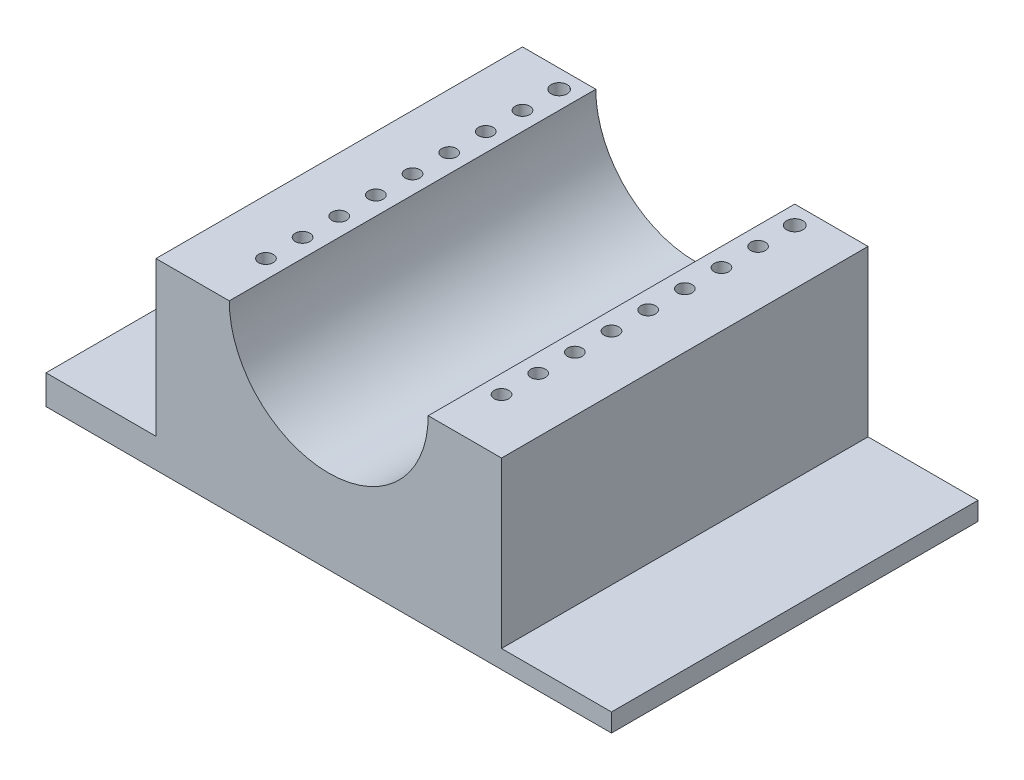
ISO-10303-21;
HEADER;
FILE_DESCRIPTION(('STEP AP214'),'2;1');
FILE_NAME('part.step','',(''),(''),'','','');
FILE_SCHEMA(('AUTOMOTIVE_DESIGN { 1 0 10303 214 1 1 1 1 }'));
ENDSEC;
DATA;
#1=APPLICATION_CONTEXT('core data for automotive mechanical design processes');
#2=APPLICATION_PROTOCOL_DEFINITION('international standard','automotive_design',2000,#1);
#3=PRODUCT_CONTEXT('',#1,'mechanical');
#4=PRODUCT('Part','Part','',(#3));
#5=PRODUCT_RELATED_PRODUCT_CATEGORY('part','',(#4));
#6=PRODUCT_DEFINITION_FORMATION('','',#4);
#7=PRODUCT_DEFINITION_CONTEXT('part definition',#1,'design');
#8=PRODUCT_DEFINITION('design','',#6,#7);
#9=PRODUCT_DEFINITION_SHAPE('','',#8);
#10=(LENGTH_UNIT() NAMED_UNIT(*) SI_UNIT(.MILLI.,.METRE.));
#11=(NAMED_UNIT(*) PLANE_ANGLE_UNIT() SI_UNIT($,.RADIAN.));
#12=(NAMED_UNIT(*) SI_UNIT($,.STERADIAN.) SOLID_ANGLE_UNIT());
#13=UNCERTAINTY_MEASURE_WITH_UNIT(LENGTH_MEASURE(1.E-05),#10,'distance_accuracy_value','');
#14=(GEOMETRIC_REPRESENTATION_CONTEXT(3) GLOBAL_UNCERTAINTY_ASSIGNED_CONTEXT((#13)) GLOBAL_UNIT_ASSIGNED_CONTEXT((#10,
#11,#12)) REPRESENTATION_CONTEXT('',''));
#15=CARTESIAN_POINT('',(0.,0.,0.));
#16=DIRECTION('',(0.,0.,1.));
#17=DIRECTION('',(1.,0.,0.));
#18=AXIS2_PLACEMENT_3D('',#15,#16,#17);
#19=CARTESIAN_POINT('',(37.1126210062295,-17.1951284898889,100.));
#20=DIRECTION('',(-1.,0.,0.));
#21=DIRECTION('',(0.,0.,1.));
#22=AXIS2_PLACEMENT_3D('',#19,#20,#21);
#23=PLANE('',#22);
#24=DIRECTION('',(0.,0.,1.));
#25=VECTOR('',#24,1.);
#26=CARTESIAN_POINT('',(37.1126210062295,-12.1951284898889,100.));
#27=LINE('',#26,#25);
#28=CARTESIAN_POINT('',(37.1126210062295,-12.1951284898889,0.));
#29=VERTEX_POINT('',#28);
#30=CARTESIAN_POINT('',(37.1126210062295,-12.1951284898889,100.));
#31=VERTEX_POINT('',#30);
#32=EDGE_CURVE('E46',#29,#31,#27,.T.);
#33=ORIENTED_EDGE('',*,*,#32,.F.);
#34=DIRECTION('',(0.,1.,0.));
#35=VECTOR('',#34,1.);
#36=CARTESIAN_POINT('',(37.1126210062295,-17.1951284898889,0.));
#37=LINE('',#36,#35);
#38=CARTESIAN_POINT('',(37.1126210062295,32.8048715101111,0.));
#39=VERTEX_POINT('',#38);
#40=EDGE_CURVE('E266',#29,#39,#37,.T.);
#41=ORIENTED_EDGE('',*,*,#40,.T.);
#42=DIRECTION('',(0.,0.,-1.));
#43=VECTOR('',#42,1.);
#44=CARTESIAN_POINT('',(37.1126210062295,32.8048715101111,100.));
#45=LINE('',#44,#43);
#46=CARTESIAN_POINT('',(37.1126210062295,32.8048715101111,100.));
#47=VERTEX_POINT('',#46);
#48=EDGE_CURVE('E11',#47,#39,#45,.T.);
#49=ORIENTED_EDGE('',*,*,#48,.F.);
#50=DIRECTION('',(0.,1.,0.));
#51=VECTOR('',#50,1.);
#52=CARTESIAN_POINT('',(37.1126210062295,-17.1951284898889,100.));
#53=LINE('',#52,#51);
#54=EDGE_CURVE('E269',#31,#47,#53,.T.);
#55=ORIENTED_EDGE('',*,*,#54,.F.);
#56=EDGE_LOOP('',(#33,#41,#49,#55));
#57=FACE_BOUND('',#56,.T.);
#58=ADVANCED_FACE('F32',(#57),#23,.F.);
#59=CARTESIAN_POINT('',(-57.1673789937705,32.8048715101111,100.));
#60=DIRECTION('',(1.,0.,0.));
#61=DIRECTION('',(0.,0.,-1.));
#62=AXIS2_PLACEMENT_3D('',#59,#60,#61);
#63=PLANE('',#62);
#64=DIRECTION('',(0.,0.,-1.));
#65=VECTOR('',#64,1.);
#66=CARTESIAN_POINT('',(-57.1673789937705,-9.19512848988893,0.));
#67=LINE('',#66,#65);
#68=CARTESIAN_POINT('',(-57.1673789937705,-9.19512848988892,100.));
#69=VERTEX_POINT('',#68);
#70=CARTESIAN_POINT('',(-57.1673789937705,-9.19512848988893,0.));
#71=VERTEX_POINT('',#70);
#72=EDGE_CURVE('E54',#69,#71,#67,.T.);
#73=ORIENTED_EDGE('',*,*,#72,.F.);
#74=DIRECTION('',(0.,-1.,0.));
#75=VECTOR('',#74,1.);
#76=CARTESIAN_POINT('',(-57.1673789937705,32.8048715101111,100.));
#77=LINE('',#76,#75);
#78=CARTESIAN_POINT('',(-57.1673789937705,32.8048715101111,100.));
#79=VERTEX_POINT('',#78);
#80=EDGE_CURVE('E121',#79,#69,#77,.T.);
#81=ORIENTED_EDGE('',*,*,#80,.F.);
#82=DIRECTION('',(0.,0.,-1.));
#83=VECTOR('',#82,1.);
#84=CARTESIAN_POINT('',(-57.1673789937705,32.8048715101111,100.));
#85=LINE('',#84,#83);
#86=CARTESIAN_POINT('',(-57.1673789937705,32.8048715101111,0.));
#87=VERTEX_POINT('',#86);
#88=EDGE_CURVE('E120',#79,#87,#85,.T.);
#89=ORIENTED_EDGE('',*,*,#88,.T.);
#90=DIRECTION('',(0.,-1.,0.));
#91=VECTOR('',#90,1.);
#92=CARTESIAN_POINT('',(-57.1673789937705,32.8048715101111,0.));
#93=LINE('',#92,#91);
#94=EDGE_CURVE('E285',#87,#71,#93,.T.);
#95=ORIENTED_EDGE('',*,*,#94,.T.);
#96=EDGE_LOOP('',(#73,#81,#89,#95));
#97=FACE_BOUND('',#96,.T.);
#98=ADVANCED_FACE('F310',(#97),#63,.F.);
#99=CARTESIAN_POINT('',(37.1126210062295,32.8048715101111,100.));
#100=DIRECTION('',(0.,-1.,0.));
#101=DIRECTION('',(1.,0.,0.));
#102=AXIS2_PLACEMENT_3D('',#99,#100,#101);
#103=PLANE('',#102);
#104=CARTESIAN_POINT('',(22.1126210062295,32.8048715101111,4.99999999999999));
#105=DIRECTION('',(0.,-1.,0.));
#106=DIRECTION('',(0.,0.,-1.));
#107=AXIS2_PLACEMENT_3D('',#104,#105,#106);
#108=CIRCLE('',#107,2.2);
#109=CARTESIAN_POINT('',(22.1126210062295,32.8048715101111,2.79999999999999));
#110=VERTEX_POINT('',#109);
#111=EDGE_CURVE('E198',#110,#110,#108,.T.);
#112=ORIENTED_EDGE('',*,*,#111,.T.);
#113=EDGE_LOOP('',(#112));
#114=FACE_BOUND('',#113,.T.);
#115=CARTESIAN_POINT('',(22.1126210062293,32.8048715101111,15.));
#116=DIRECTION('',(0.,-1.,0.));
#117=DIRECTION('',(0.,0.,-1.));
#118=AXIS2_PLACEMENT_3D('',#115,#116,#117);
#119=CIRCLE('',#118,2.00000000000001);
#120=CARTESIAN_POINT('',(22.1126210062293,32.8048715101111,13.));
#121=VERTEX_POINT('',#120);
#122=EDGE_CURVE('E204',#121,#121,#119,.T.);
#123=ORIENTED_EDGE('',*,*,#122,.T.);
#124=EDGE_LOOP('',(#123));
#125=FACE_BOUND('',#124,.T.);
#126=CARTESIAN_POINT('',(22.1126210062292,32.8048715101111,25.));
#127=DIRECTION('',(0.,-1.,0.));
#128=DIRECTION('',(0.,0.,-1.));
#129=AXIS2_PLACEMENT_3D('',#126,#127,#128);
#130=CIRCLE('',#129,2.);
#131=CARTESIAN_POINT('',(22.1126210062292,32.8048715101111,23.));
#132=VERTEX_POINT('',#131);
#133=EDGE_CURVE('E210',#132,#132,#130,.T.);
#134=ORIENTED_EDGE('',*,*,#133,.T.);
#135=EDGE_LOOP('',(#134));
#136=FACE_BOUND('',#135,.T.);
#137=CARTESIAN_POINT('',(22.1126210062287,32.8048715101111,75.));
#138=DIRECTION('',(0.,-1.,0.));
#139=DIRECTION('',(0.,0.,-1.));
#140=AXIS2_PLACEMENT_3D('',#137,#138,#139);
#141=CIRCLE('',#140,2.);
#142=CARTESIAN_POINT('',(22.1126210062287,32.8048715101111,73.));
#143=VERTEX_POINT('',#142);
#144=EDGE_CURVE('E167',#143,#143,#141,.T.);
#145=ORIENTED_EDGE('',*,*,#144,.T.);
#146=EDGE_LOOP('',(#145));
#147=FACE_BOUND('',#146,.T.);
#148=CARTESIAN_POINT('',(22.1126210062289,32.8048715101111,55.));
#149=DIRECTION('',(0.,-1.,0.));
#150=DIRECTION('',(0.,0.,-1.));
#151=AXIS2_PLACEMENT_3D('',#148,#149,#150);
#152=CIRCLE('',#151,2.);
#153=CARTESIAN_POINT('',(22.1126210062289,32.8048715101111,53.));
#154=VERTEX_POINT('',#153);
#155=EDGE_CURVE('E186',#154,#154,#152,.T.);
#156=ORIENTED_EDGE('',*,*,#155,.T.);
#157=EDGE_LOOP('',(#156));
#158=FACE_BOUND('',#157,.T.);
#159=CARTESIAN_POINT('',(22.1126210062291,32.8048715101111,45.));
#160=DIRECTION('',(0.,-1.,0.));
#161=DIRECTION('',(0.,0.,-1.));
#162=AXIS2_PLACEMENT_3D('',#159,#160,#161);
#163=CIRCLE('',#162,2.);
#164=CARTESIAN_POINT('',(22.1126210062291,32.8048715101111,43.));
#165=VERTEX_POINT('',#164);
#166=EDGE_CURVE('E179',#165,#165,#163,.T.);
#167=ORIENTED_EDGE('',*,*,#166,.T.);
#168=EDGE_LOOP('',(#167));
#169=FACE_BOUND('',#168,.T.);
#170=CARTESIAN_POINT('',(22.1126210062291,32.8048715101111,35.));
#171=DIRECTION('',(0.,1.,0.));
#172=DIRECTION('',(0.,0.,1.));
#173=AXIS2_PLACEMENT_3D('',#170,#171,#172);
#174=CIRCLE('',#173,2.00000000000001);
#175=CARTESIAN_POINT('',(22.1126210062291,32.8048715101111,37.));
#176=VERTEX_POINT('',#175);
#177=EDGE_CURVE('E258',#176,#176,#174,.F.);
#178=ORIENTED_EDGE('',*,*,#177,.T.);
#179=EDGE_LOOP('',(#178));
#180=FACE_BOUND('',#179,.T.);
#181=CARTESIAN_POINT('',(22.1126210062288,32.8048715101111,65.));
#182=DIRECTION('',(0.,1.,0.));
#183=DIRECTION('',(0.,0.,1.));
#184=AXIS2_PLACEMENT_3D('',#181,#182,#183);
#185=CIRCLE('',#184,2.);
#186=CARTESIAN_POINT('',(22.1126210062288,32.8048715101111,67.));
#187=VERTEX_POINT('',#186);
#188=EDGE_CURVE('E215',#187,#187,#185,.F.);
#189=ORIENTED_EDGE('',*,*,#188,.T.);
#190=EDGE_LOOP('',(#189));
#191=FACE_BOUND('',#190,.T.);
#192=CARTESIAN_POINT('',(22.1126210062286,32.8048715101111,85.));
#193=DIRECTION('',(0.,1.,0.));
#194=DIRECTION('',(0.,0.,1.));
#195=AXIS2_PLACEMENT_3D('',#192,#193,#194);
#196=CIRCLE('',#195,2.00000000000001);
#197=CARTESIAN_POINT('',(22.1126210062286,32.8048715101111,87.));
#198=VERTEX_POINT('',#197);
#199=EDGE_CURVE('E242',#198,#198,#196,.F.);
#200=ORIENTED_EDGE('',*,*,#199,.T.);
#201=EDGE_LOOP('',(#200));
#202=FACE_BOUND('',#201,.T.);
#203=DIRECTION('',(-1.,0.,0.));
#204=VECTOR('',#203,1.);
#205=CARTESIAN_POINT('',(37.1126210062295,32.8048715101111,0.));
#206=LINE('',#205,#204);
#207=CARTESIAN_POINT('',(17.1126210062295,32.8048715101111,0.));
#208=VERTEX_POINT('',#207);
#209=EDGE_CURVE('E279',#39,#208,#206,.T.);
#210=ORIENTED_EDGE('',*,*,#209,.T.);
#211=DIRECTION('',(0.,0.,-1.));
#212=VECTOR('',#211,1.);
#213=CARTESIAN_POINT('',(17.1126210062295,32.8048715101111,100.));
#214=LINE('',#213,#212);
#215=CARTESIAN_POINT('',(17.1126210062295,32.8048715101111,100.));
#216=VERTEX_POINT('',#215);
#217=EDGE_CURVE('E39',#216,#208,#214,.T.);
#218=ORIENTED_EDGE('',*,*,#217,.F.);
#219=DIRECTION('',(-1.,0.,0.));
#220=VECTOR('',#219,1.);
#221=CARTESIAN_POINT('',(37.1126210062295,32.8048715101111,100.));
#222=LINE('',#221,#220);
#223=EDGE_CURVE('E271',#47,#216,#222,.T.);
#224=ORIENTED_EDGE('',*,*,#223,.F.);
#225=ORIENTED_EDGE('',*,*,#48,.T.);
#226=EDGE_LOOP('',(#210,#218,#224,#225));
#227=FACE_BOUND('',#226,.T.);
#228=ADVANCED_FACE('F322',(#114,#125,#136,#147,#158,#169,#180,#191,#202,#227),#103,.F.);
#229=CARTESIAN_POINT('',(-10.0273789937705,32.8048715101111,100.));
#230=DIRECTION('',(0.,0.,-1.));
#231=DIRECTION('',(-1.,0.,0.));
#232=AXIS2_PLACEMENT_3D('',#229,#230,#231);
#233=CYLINDRICAL_SURFACE('',#232,27.14);
#234=CARTESIAN_POINT('',(-10.0273789937705,32.8048715101111,0.));
#235=DIRECTION('',(0.,0.,-1.));
#236=DIRECTION('',(-1.,0.,0.));
#237=AXIS2_PLACEMENT_3D('',#234,#235,#236);
#238=CIRCLE('',#237,27.14);
#239=CARTESIAN_POINT('',(-37.1673789937705,32.8048715101111,0.));
#240=VERTEX_POINT('',#239);
#241=EDGE_CURVE('E281',#208,#240,#238,.T.);
#242=ORIENTED_EDGE('',*,*,#241,.T.);
#243=DIRECTION('',(0.,0.,-1.));
#244=VECTOR('',#243,1.);
#245=CARTESIAN_POINT('',(-37.1673789937705,32.8048715101111,100.));
#246=LINE('',#245,#244);
#247=CARTESIAN_POINT('',(-37.1673789937705,32.8048715101111,100.));
#248=VERTEX_POINT('',#247);
#249=EDGE_CURVE('E290',#248,#240,#246,.T.);
#250=ORIENTED_EDGE('',*,*,#249,.F.);
#251=CARTESIAN_POINT('',(-10.0273789937705,32.8048715101111,100.));
#252=DIRECTION('',(0.,0.,-1.));
#253=DIRECTION('',(-1.,0.,0.));
#254=AXIS2_PLACEMENT_3D('',#251,#252,#253);
#255=CIRCLE('',#254,27.14);
#256=EDGE_CURVE('E273',#216,#248,#255,.T.);
#257=ORIENTED_EDGE('',*,*,#256,.F.);
#258=ORIENTED_EDGE('',*,*,#217,.T.);
#259=EDGE_LOOP('',(#242,#250,#257,#258));
#260=FACE_BOUND('',#259,.T.);
#261=ADVANCED_FACE('F297',(#260),#233,.F.);
#262=CARTESIAN_POINT('',(-57.1673789937705,32.8048715101111,100.));
#263=DIRECTION('',(0.,-1.,0.));
#264=DIRECTION('',(0.,0.,-1.));
#265=AXIS2_PLACEMENT_3D('',#262,#263,#264);
#266=PLANE('',#265);
#267=CARTESIAN_POINT('',(-42.1673789937705,32.8048715101111,5.00000000000005));
#268=DIRECTION('',(0.,1.,0.));
#269=DIRECTION('',(0.,0.,1.));
#270=AXIS2_PLACEMENT_3D('',#267,#268,#269);
#271=CIRCLE('',#270,2.2);
#272=CARTESIAN_POINT('',(-42.1673789937705,32.8048715101111,7.20000000000005));
#273=VERTEX_POINT('',#272);
#274=EDGE_CURVE('E191',#273,#273,#271,.T.);
#275=ORIENTED_EDGE('',*,*,#274,.F.);
#276=EDGE_LOOP('',(#275));
#277=FACE_BOUND('',#276,.T.);
#278=CARTESIAN_POINT('',(-42.1673789937704,32.8048715101111,15.));
#279=DIRECTION('',(0.,1.,0.));
#280=DIRECTION('',(0.,0.,1.));
#281=AXIS2_PLACEMENT_3D('',#278,#279,#280);
#282=CIRCLE('',#281,2.);
#283=CARTESIAN_POINT('',(-42.1673789937704,32.8048715101111,17.));
#284=VERTEX_POINT('',#283);
#285=EDGE_CURVE('E174',#284,#284,#282,.T.);
#286=ORIENTED_EDGE('',*,*,#285,.F.);
#287=EDGE_LOOP('',(#286));
#288=FACE_BOUND('',#287,.T.);
#289=CARTESIAN_POINT('',(-42.1673789937697,32.8048715101111,85.));
#290=DIRECTION('',(0.,1.,0.));
#291=DIRECTION('',(0.,0.,1.));
#292=AXIS2_PLACEMENT_3D('',#289,#290,#291);
#293=CIRCLE('',#292,2.);
#294=CARTESIAN_POINT('',(-42.1673789937697,32.8048715101111,87.));
#295=VERTEX_POINT('',#294);
#296=EDGE_CURVE('E239',#295,#295,#293,.T.);
#297=ORIENTED_EDGE('',*,*,#296,.F.);
#298=EDGE_LOOP('',(#297));
#299=FACE_BOUND('',#298,.T.);
#300=CARTESIAN_POINT('',(-42.1673789937698,32.8048715101111,75.));
#301=DIRECTION('',(0.,1.,0.));
#302=DIRECTION('',(0.,0.,1.));
#303=AXIS2_PLACEMENT_3D('',#300,#301,#302);
#304=CIRCLE('',#303,2.);
#305=CARTESIAN_POINT('',(-42.1673789937698,32.8048715101111,77.));
#306=VERTEX_POINT('',#305);
#307=EDGE_CURVE('E246',#306,#306,#304,.T.);
#308=ORIENTED_EDGE('',*,*,#307,.F.);
#309=EDGE_LOOP('',(#308));
#310=FACE_BOUND('',#309,.T.);
#311=CARTESIAN_POINT('',(-42.1673789937699,32.8048715101111,65.));
#312=DIRECTION('',(0.,1.,0.));
#313=DIRECTION('',(0.,0.,1.));
#314=AXIS2_PLACEMENT_3D('',#311,#312,#313);
#315=CIRCLE('',#314,2.);
#316=CARTESIAN_POINT('',(-42.1673789937699,32.8048715101111,67.));
#317=VERTEX_POINT('',#316);
#318=EDGE_CURVE('E252',#317,#317,#315,.T.);
#319=ORIENTED_EDGE('',*,*,#318,.F.);
#320=EDGE_LOOP('',(#319));
#321=FACE_BOUND('',#320,.T.);
#322=CARTESIAN_POINT('',(-42.16737899377,32.8048715101111,55.));
#323=DIRECTION('',(0.,1.,0.));
#324=DIRECTION('',(0.,0.,1.));
#325=AXIS2_PLACEMENT_3D('',#322,#323,#324);
#326=CIRCLE('',#325,2.);
#327=CARTESIAN_POINT('',(-42.16737899377,32.8048715101111,57.));
#328=VERTEX_POINT('',#327);
#329=EDGE_CURVE('E222',#328,#328,#326,.T.);
#330=ORIENTED_EDGE('',*,*,#329,.F.);
#331=EDGE_LOOP('',(#330));
#332=FACE_BOUND('',#331,.T.);
#333=CARTESIAN_POINT('',(-42.1673789937701,32.8048715101111,45.));
#334=DIRECTION('',(0.,1.,0.));
#335=DIRECTION('',(0.,0.,1.));
#336=AXIS2_PLACEMENT_3D('',#333,#334,#335);
#337=CIRCLE('',#336,2.);
#338=CARTESIAN_POINT('',(-42.1673789937701,32.8048715101111,47.));
#339=VERTEX_POINT('',#338);
#340=EDGE_CURVE('E228',#339,#339,#337,.T.);
#341=ORIENTED_EDGE('',*,*,#340,.F.);
#342=EDGE_LOOP('',(#341));
#343=FACE_BOUND('',#342,.T.);
#344=CARTESIAN_POINT('',(-42.1673789937702,32.8048715101111,35.));
#345=DIRECTION('',(0.,1.,0.));
#346=DIRECTION('',(0.,0.,1.));
#347=AXIS2_PLACEMENT_3D('',#344,#345,#346);
#348=CIRCLE('',#347,2.);
#349=CARTESIAN_POINT('',(-42.1673789937702,32.8048715101111,37.));
#350=VERTEX_POINT('',#349);
#351=EDGE_CURVE('E234',#350,#350,#348,.T.);
#352=ORIENTED_EDGE('',*,*,#351,.F.);
#353=EDGE_LOOP('',(#352));
#354=FACE_BOUND('',#353,.T.);
#355=CARTESIAN_POINT('',(-42.1673789937703,32.8048715101111,25.));
#356=DIRECTION('',(0.,1.,0.));
#357=DIRECTION('',(0.,0.,1.));
#358=AXIS2_PLACEMENT_3D('',#355,#356,#357);
#359=CIRCLE('',#358,2.);
#360=CARTESIAN_POINT('',(-42.1673789937703,32.8048715101111,27.));
#361=VERTEX_POINT('',#360);
#362=EDGE_CURVE('E161',#361,#361,#359,.T.);
#363=ORIENTED_EDGE('',*,*,#362,.F.);
#364=EDGE_LOOP('',(#363));
#365=FACE_BOUND('',#364,.T.);
#366=DIRECTION('',(-1.,0.,0.));
#367=VECTOR('',#366,1.);
#368=CARTESIAN_POINT('',(-57.1673789937705,32.8048715101111,0.));
#369=LINE('',#368,#367);
#370=EDGE_CURVE('E283',#240,#87,#369,.T.);
#371=ORIENTED_EDGE('',*,*,#370,.T.);
#372=ORIENTED_EDGE('',*,*,#88,.F.);
#373=DIRECTION('',(-1.,0.,0.));
#374=VECTOR('',#373,1.);
#375=CARTESIAN_POINT('',(-57.1673789937705,32.8048715101111,100.));
#376=LINE('',#375,#374);
#377=EDGE_CURVE('E275',#248,#79,#376,.T.);
#378=ORIENTED_EDGE('',*,*,#377,.F.);
#379=ORIENTED_EDGE('',*,*,#249,.T.);
#380=EDGE_LOOP('',(#371,#372,#378,#379));
#381=FACE_BOUND('',#380,.T.);
#382=ADVANCED_FACE('F308',(#277,#288,#299,#310,#321,#332,#343,#354,#365,#381),#266,.F.);
#383=CARTESIAN_POINT('',(37.1126210062295,-17.1951284898889,100.));
#384=DIRECTION('',(0.,1.,0.));
#385=DIRECTION('',(-1.,0.,0.));
#386=AXIS2_PLACEMENT_3D('',#383,#384,#385);
#387=PLANE('',#386);
#388=DIRECTION('',(1.,0.,0.));
#389=VECTOR('',#388,1.);
#390=CARTESIAN_POINT('',(37.1126210062295,-17.1951284898889,0.));
#391=LINE('',#390,#389);
#392=CARTESIAN_POINT('',(-87.1673789937705,-17.1951284898889,0.));
#393=VERTEX_POINT('',#392);
#394=CARTESIAN_POINT('',(67.1126210062295,-17.1951284898889,0.));
#395=VERTEX_POINT('',#394);
#396=EDGE_CURVE('E126',#393,#395,#391,.T.);
#397=ORIENTED_EDGE('',*,*,#396,.T.);
#398=DIRECTION('',(0.,0.,-1.));
#399=VECTOR('',#398,1.);
#400=CARTESIAN_POINT('',(67.1126210062295,-17.1951284898889,100.));
#401=LINE('',#400,#399);
#402=CARTESIAN_POINT('',(67.1126210062295,-17.1951284898889,100.));
#403=VERTEX_POINT('',#402);
#404=EDGE_CURVE('E124',#403,#395,#401,.T.);
#405=ORIENTED_EDGE('',*,*,#404,.F.);
#406=DIRECTION('',(1.,0.,0.));
#407=VECTOR('',#406,1.);
#408=CARTESIAN_POINT('',(37.1126210062295,-17.1951284898889,100.));
#409=LINE('',#408,#407);
#410=CARTESIAN_POINT('',(-87.1673789937705,-17.1951284898889,100.));
#411=VERTEX_POINT('',#410);
#412=EDGE_CURVE('E109',#411,#403,#409,.T.);
#413=ORIENTED_EDGE('',*,*,#412,.F.);
#414=DIRECTION('',(0.,0.,1.));
#415=VECTOR('',#414,1.);
#416=CARTESIAN_POINT('',(-87.1673789937705,-17.1951284898889,0.));
#417=LINE('',#416,#415);
#418=EDGE_CURVE('E148',#393,#411,#417,.T.);
#419=ORIENTED_EDGE('',*,*,#418,.F.);
#420=EDGE_LOOP('',(#397,#405,#413,#419));
#421=FACE_BOUND('',#420,.T.);
#422=ADVANCED_FACE('F125',(#421),#387,.F.);
#423=CARTESIAN_POINT('',(-10.0273789937705,32.8048715101111,100.));
#424=DIRECTION('',(0.,0.,-1.));
#425=DIRECTION('',(-1.,0.,0.));
#426=AXIS2_PLACEMENT_3D('',#423,#424,#425);
#427=PLANE('',#426);
#428=ORIENTED_EDGE('',*,*,#412,.T.);
#429=DIRECTION('',(0.,-1.,0.));
#430=VECTOR('',#429,1.);
#431=CARTESIAN_POINT('',(67.1126210062295,-17.1951284898889,100.));
#432=LINE('',#431,#430);
#433=CARTESIAN_POINT('',(67.1126210062295,-12.1951284898889,100.));
#434=VERTEX_POINT('',#433);
#435=EDGE_CURVE('E114',#434,#403,#432,.T.);
#436=ORIENTED_EDGE('',*,*,#435,.F.);
#437=DIRECTION('',(-1.,0.,0.));
#438=VECTOR('',#437,1.);
#439=CARTESIAN_POINT('',(67.1126210062295,-12.1951284898889,100.));
#440=LINE('',#439,#438);
#441=EDGE_CURVE('E139',#434,#31,#440,.T.);
#442=ORIENTED_EDGE('',*,*,#441,.T.);
#443=ORIENTED_EDGE('',*,*,#54,.T.);
#444=ORIENTED_EDGE('',*,*,#223,.T.);
#445=ORIENTED_EDGE('',*,*,#256,.T.);
#446=ORIENTED_EDGE('',*,*,#377,.T.);
#447=ORIENTED_EDGE('',*,*,#80,.T.);
#448=DIRECTION('',(1.,0.,0.));
#449=VECTOR('',#448,1.);
#450=CARTESIAN_POINT('',(-87.1673789937705,-9.19512848988893,100.));
#451=LINE('',#450,#449);
#452=CARTESIAN_POINT('',(-87.1673789937705,-9.19512848988893,100.));
#453=VERTEX_POINT('',#452);
#454=EDGE_CURVE('E157',#453,#69,#451,.T.);
#455=ORIENTED_EDGE('',*,*,#454,.F.);
#456=DIRECTION('',(0.,1.,0.));
#457=VECTOR('',#456,1.);
#458=CARTESIAN_POINT('',(-87.1673789937705,-17.1951284898889,100.));
#459=LINE('',#458,#457);
#460=EDGE_CURVE('E116',#411,#453,#459,.T.);
#461=ORIENTED_EDGE('',*,*,#460,.F.);
#462=EDGE_LOOP('',(#428,#436,#442,#443,#444,#445,#446,#447,#455,#461));
#463=FACE_BOUND('',#462,.T.);
#464=ADVANCED_FACE('F111',(#463),#427,.F.);
#465=CARTESIAN_POINT('',(-10.0273789937705,32.8048715101111,0.));
#466=DIRECTION('',(0.,0.,-1.));
#467=DIRECTION('',(-1.,0.,0.));
#468=AXIS2_PLACEMENT_3D('',#465,#466,#467);
#469=PLANE('',#468);
#470=ORIENTED_EDGE('',*,*,#40,.F.);
#471=DIRECTION('',(-1.,0.,0.));
#472=VECTOR('',#471,1.);
#473=CARTESIAN_POINT('',(67.1126210062295,-12.1951284898889,0.));
#474=LINE('',#473,#472);
#475=CARTESIAN_POINT('',(67.1126210062295,-12.1951284898889,0.));
#476=VERTEX_POINT('',#475);
#477=EDGE_CURVE('E142',#476,#29,#474,.T.);
#478=ORIENTED_EDGE('',*,*,#477,.F.);
#479=DIRECTION('',(0.,1.,0.));
#480=VECTOR('',#479,1.);
#481=CARTESIAN_POINT('',(67.1126210062295,-17.1951284898889,0.));
#482=LINE('',#481,#480);
#483=EDGE_CURVE('E129',#395,#476,#482,.T.);
#484=ORIENTED_EDGE('',*,*,#483,.F.);
#485=ORIENTED_EDGE('',*,*,#396,.F.);
#486=DIRECTION('',(0.,-1.,0.));
#487=VECTOR('',#486,1.);
#488=CARTESIAN_POINT('',(-87.1673789937705,-17.1951284898889,0.));
#489=LINE('',#488,#487);
#490=CARTESIAN_POINT('',(-87.1673789937705,-9.19512848988893,0.));
#491=VERTEX_POINT('',#490);
#492=EDGE_CURVE('E145',#491,#393,#489,.T.);
#493=ORIENTED_EDGE('',*,*,#492,.F.);
#494=DIRECTION('',(1.,0.,0.));
#495=VECTOR('',#494,1.);
#496=CARTESIAN_POINT('',(-87.1673789937705,-9.19512848988893,0.));
#497=LINE('',#496,#495);
#498=EDGE_CURVE('E153',#491,#71,#497,.T.);
#499=ORIENTED_EDGE('',*,*,#498,.T.);
#500=ORIENTED_EDGE('',*,*,#94,.F.);
#501=ORIENTED_EDGE('',*,*,#370,.F.);
#502=ORIENTED_EDGE('',*,*,#241,.F.);
#503=ORIENTED_EDGE('',*,*,#209,.F.);
#504=EDGE_LOOP('',(#470,#478,#484,#485,#493,#499,#500,#501,#502,#503));
#505=FACE_BOUND('',#504,.T.);
#506=ADVANCED_FACE('F304',(#505),#469,.T.);
#507=CARTESIAN_POINT('',(-42.1673789937703,26.8048715101111,25.));
#508=DIRECTION('',(0.,1.,0.));
#509=DIRECTION('',(0.,0.,1.));
#510=AXIS2_PLACEMENT_3D('',#507,#508,#509);
#511=CYLINDRICAL_SURFACE('',#510,2.);
#512=CARTESIAN_POINT('',(-42.1673789937703,26.8048715101111,25.));
#513=DIRECTION('',(0.,1.,0.));
#514=DIRECTION('',(0.,0.,1.));
#515=AXIS2_PLACEMENT_3D('',#512,#513,#514);
#516=CIRCLE('',#515,2.);
#517=CARTESIAN_POINT('',(-42.1673789937703,26.8048715101111,27.));
#518=VERTEX_POINT('',#517);
#519=EDGE_CURVE('E160',#518,#518,#516,.T.);
#520=ORIENTED_EDGE('',*,*,#519,.F.);
#521=EDGE_LOOP('',(#520));
#522=FACE_BOUND('',#521,.T.);
#523=ORIENTED_EDGE('',*,*,#362,.T.);
#524=EDGE_LOOP('',(#523));
#525=FACE_BOUND('',#524,.T.);
#526=ADVANCED_FACE('F365',(#522,#525),#511,.F.);
#527=CARTESIAN_POINT('',(-42.1673789937703,26.8048715101111,25.));
#528=DIRECTION('',(0.,1.,0.));
#529=DIRECTION('',(0.,0.,1.));
#530=AXIS2_PLACEMENT_3D('',#527,#528,#529);
#531=PLANE('',#530);
#532=ORIENTED_EDGE('',*,*,#519,.T.);
#533=EDGE_LOOP('',(#532));
#534=FACE_BOUND('',#533,.T.);
#535=ADVANCED_FACE('F371',(#534),#531,.T.);
#536=CARTESIAN_POINT('',(-42.1673789937702,26.8048715101111,35.));
#537=DIRECTION('',(0.,1.,0.));
#538=DIRECTION('',(0.,0.,1.));
#539=AXIS2_PLACEMENT_3D('',#536,#537,#538);
#540=CYLINDRICAL_SURFACE('',#539,2.);
#541=CARTESIAN_POINT('',(-42.1673789937702,26.8048715101111,35.));
#542=DIRECTION('',(0.,1.,0.));
#543=DIRECTION('',(0.,0.,1.));
#544=AXIS2_PLACEMENT_3D('',#541,#542,#543);
#545=CIRCLE('',#544,2.);
#546=CARTESIAN_POINT('',(-42.1673789937702,26.8048715101111,37.));
#547=VERTEX_POINT('',#546);
#548=EDGE_CURVE('E194',#547,#547,#545,.T.);
#549=ORIENTED_EDGE('',*,*,#548,.F.);
#550=EDGE_LOOP('',(#549));
#551=FACE_BOUND('',#550,.T.);
#552=ORIENTED_EDGE('',*,*,#351,.T.);
#553=EDGE_LOOP('',(#552));
#554=FACE_BOUND('',#553,.T.);
#555=ADVANCED_FACE('F379',(#551,#554),#540,.F.);
#556=CARTESIAN_POINT('',(-42.1673789937702,26.8048715101111,35.));
#557=DIRECTION('',(0.,1.,0.));
#558=DIRECTION('',(0.,0.,1.));
#559=AXIS2_PLACEMENT_3D('',#556,#557,#558);
#560=PLANE('',#559);
#561=ORIENTED_EDGE('',*,*,#548,.T.);
#562=EDGE_LOOP('',(#561));
#563=FACE_BOUND('',#562,.T.);
#564=ADVANCED_FACE('F387',(#563),#560,.T.);
#565=CARTESIAN_POINT('',(-42.1673789937701,26.8048715101111,45.));
#566=DIRECTION('',(0.,1.,0.));
#567=DIRECTION('',(0.,0.,1.));
#568=AXIS2_PLACEMENT_3D('',#565,#566,#567);
#569=CYLINDRICAL_SURFACE('',#568,2.);
#570=CARTESIAN_POINT('',(-42.1673789937701,26.8048715101111,45.));
#571=DIRECTION('',(0.,1.,0.));
#572=DIRECTION('',(0.,0.,1.));
#573=AXIS2_PLACEMENT_3D('',#570,#571,#572);
#574=CIRCLE('',#573,2.);
#575=CARTESIAN_POINT('',(-42.1673789937701,26.8048715101111,47.));
#576=VERTEX_POINT('',#575);
#577=EDGE_CURVE('E231',#576,#576,#574,.T.);
#578=ORIENTED_EDGE('',*,*,#577,.F.);
#579=EDGE_LOOP('',(#578));
#580=FACE_BOUND('',#579,.T.);
#581=ORIENTED_EDGE('',*,*,#340,.T.);
#582=EDGE_LOOP('',(#581));
#583=FACE_BOUND('',#582,.T.);
#584=ADVANCED_FACE('F395',(#580,#583),#569,.F.);
#585=CARTESIAN_POINT('',(-42.1673789937701,26.8048715101111,45.));
#586=DIRECTION('',(0.,1.,0.));
#587=DIRECTION('',(0.,0.,1.));
#588=AXIS2_PLACEMENT_3D('',#585,#586,#587);
#589=PLANE('',#588);
#590=ORIENTED_EDGE('',*,*,#577,.T.);
#591=EDGE_LOOP('',(#590));
#592=FACE_BOUND('',#591,.T.);
#593=ADVANCED_FACE('F403',(#592),#589,.T.);
#594=CARTESIAN_POINT('',(-42.16737899377,26.8048715101111,55.));
#595=DIRECTION('',(0.,1.,0.));
#596=DIRECTION('',(0.,0.,1.));
#597=AXIS2_PLACEMENT_3D('',#594,#595,#596);
#598=CYLINDRICAL_SURFACE('',#597,2.);
#599=CARTESIAN_POINT('',(-42.16737899377,26.8048715101111,55.));
#600=DIRECTION('',(0.,1.,0.));
#601=DIRECTION('',(0.,0.,1.));
#602=AXIS2_PLACEMENT_3D('',#599,#600,#601);
#603=CIRCLE('',#602,2.);
#604=CARTESIAN_POINT('',(-42.16737899377,26.8048715101111,57.));
#605=VERTEX_POINT('',#604);
#606=EDGE_CURVE('E225',#605,#605,#603,.T.);
#607=ORIENTED_EDGE('',*,*,#606,.F.);
#608=EDGE_LOOP('',(#607));
#609=FACE_BOUND('',#608,.T.);
#610=ORIENTED_EDGE('',*,*,#329,.T.);
#611=EDGE_LOOP('',(#610));
#612=FACE_BOUND('',#611,.T.);
#613=ADVANCED_FACE('F411',(#609,#612),#598,.F.);
#614=CARTESIAN_POINT('',(-42.16737899377,26.8048715101111,55.));
#615=DIRECTION('',(0.,1.,0.));
#616=DIRECTION('',(0.,0.,1.));
#617=AXIS2_PLACEMENT_3D('',#614,#615,#616);
#618=PLANE('',#617);
#619=ORIENTED_EDGE('',*,*,#606,.T.);
#620=EDGE_LOOP('',(#619));
#621=FACE_BOUND('',#620,.T.);
#622=ADVANCED_FACE('F419',(#621),#618,.T.);
#623=CARTESIAN_POINT('',(-42.1673789937699,26.8048715101111,65.));
#624=DIRECTION('',(0.,1.,0.));
#625=DIRECTION('',(0.,0.,1.));
#626=AXIS2_PLACEMENT_3D('',#623,#624,#625);
#627=CYLINDRICAL_SURFACE('',#626,2.);
#628=CARTESIAN_POINT('',(-42.1673789937699,26.8048715101111,65.));
#629=DIRECTION('',(0.,1.,0.));
#630=DIRECTION('',(0.,0.,1.));
#631=AXIS2_PLACEMENT_3D('',#628,#629,#630);
#632=CIRCLE('',#631,2.);
#633=CARTESIAN_POINT('',(-42.1673789937699,26.8048715101111,67.));
#634=VERTEX_POINT('',#633);
#635=EDGE_CURVE('E255',#634,#634,#632,.T.);
#636=ORIENTED_EDGE('',*,*,#635,.F.);
#637=EDGE_LOOP('',(#636));
#638=FACE_BOUND('',#637,.T.);
#639=ORIENTED_EDGE('',*,*,#318,.T.);
#640=EDGE_LOOP('',(#639));
#641=FACE_BOUND('',#640,.T.);
#642=ADVANCED_FACE('F427',(#638,#641),#627,.F.);
#643=CARTESIAN_POINT('',(0.,26.8048715101111,0.));
#644=DIRECTION('',(0.,1.,0.));
#645=DIRECTION('',(0.,0.,1.));
#646=AXIS2_PLACEMENT_3D('',#643,#644,#645);
#647=PLANE('',#646);
#648=ORIENTED_EDGE('',*,*,#635,.T.);
#649=EDGE_LOOP('',(#648));
#650=FACE_BOUND('',#649,.T.);
#651=ADVANCED_FACE('F435',(#650),#647,.T.);
#652=CARTESIAN_POINT('',(-42.1673789937698,26.8048715101111,75.));
#653=DIRECTION('',(0.,1.,0.));
#654=DIRECTION('',(0.,0.,1.));
#655=AXIS2_PLACEMENT_3D('',#652,#653,#654);
#656=CYLINDRICAL_SURFACE('',#655,2.);
#657=CARTESIAN_POINT('',(-42.1673789937698,26.8048715101111,75.));
#658=DIRECTION('',(0.,1.,0.));
#659=DIRECTION('',(0.,0.,1.));
#660=AXIS2_PLACEMENT_3D('',#657,#658,#659);
#661=CIRCLE('',#660,2.);
#662=CARTESIAN_POINT('',(-42.1673789937698,26.8048715101111,77.));
#663=VERTEX_POINT('',#662);
#664=EDGE_CURVE('E249',#663,#663,#661,.T.);
#665=ORIENTED_EDGE('',*,*,#664,.F.);
#666=EDGE_LOOP('',(#665));
#667=FACE_BOUND('',#666,.T.);
#668=ORIENTED_EDGE('',*,*,#307,.T.);
#669=EDGE_LOOP('',(#668));
#670=FACE_BOUND('',#669,.T.);
#671=ADVANCED_FACE('F443',(#667,#670),#656,.F.);
#672=CARTESIAN_POINT('',(0.,26.8048715101111,0.));
#673=DIRECTION('',(0.,1.,0.));
#674=DIRECTION('',(0.,0.,1.));
#675=AXIS2_PLACEMENT_3D('',#672,#673,#674);
#676=PLANE('',#675);
#677=ORIENTED_EDGE('',*,*,#664,.T.);
#678=EDGE_LOOP('',(#677));
#679=FACE_BOUND('',#678,.T.);
#680=ADVANCED_FACE('F451',(#679),#676,.T.);
#681=CARTESIAN_POINT('',(-42.1673789937697,26.8048715101111,85.));
#682=DIRECTION('',(0.,1.,0.));
#683=DIRECTION('',(0.,0.,1.));
#684=AXIS2_PLACEMENT_3D('',#681,#682,#683);
#685=CYLINDRICAL_SURFACE('',#684,2.);
#686=CARTESIAN_POINT('',(-42.1673789937697,26.8048715101111,85.));
#687=DIRECTION('',(0.,1.,0.));
#688=DIRECTION('',(0.,0.,1.));
#689=AXIS2_PLACEMENT_3D('',#686,#687,#688);
#690=CIRCLE('',#689,2.);
#691=CARTESIAN_POINT('',(-42.1673789937697,26.8048715101111,87.));
#692=VERTEX_POINT('',#691);
#693=EDGE_CURVE('E243',#692,#692,#690,.T.);
#694=ORIENTED_EDGE('',*,*,#693,.F.);
#695=EDGE_LOOP('',(#694));
#696=FACE_BOUND('',#695,.T.);
#697=ORIENTED_EDGE('',*,*,#296,.T.);
#698=EDGE_LOOP('',(#697));
#699=FACE_BOUND('',#698,.T.);
#700=ADVANCED_FACE('F459',(#696,#699),#685,.F.);
#701=CARTESIAN_POINT('',(0.,26.8048715101111,0.));
#702=DIRECTION('',(0.,1.,0.));
#703=DIRECTION('',(0.,0.,1.));
#704=AXIS2_PLACEMENT_3D('',#701,#702,#703);
#705=PLANE('',#704);
#706=ORIENTED_EDGE('',*,*,#693,.T.);
#707=EDGE_LOOP('',(#706));
#708=FACE_BOUND('',#707,.T.);
#709=ADVANCED_FACE('F467',(#708),#705,.T.);
#710=CARTESIAN_POINT('',(-42.1673789937704,26.8048715101111,15.));
#711=DIRECTION('',(0.,1.,0.));
#712=DIRECTION('',(0.,0.,1.));
#713=AXIS2_PLACEMENT_3D('',#710,#711,#712);
#714=CYLINDRICAL_SURFACE('',#713,2.);
#715=CARTESIAN_POINT('',(-42.1673789937704,26.8048715101111,15.));
#716=DIRECTION('',(0.,1.,0.));
#717=DIRECTION('',(0.,0.,1.));
#718=AXIS2_PLACEMENT_3D('',#715,#716,#717);
#719=CIRCLE('',#718,2.);
#720=CARTESIAN_POINT('',(-42.1673789937704,26.8048715101111,17.));
#721=VERTEX_POINT('',#720);
#722=EDGE_CURVE('E164',#721,#721,#719,.T.);
#723=ORIENTED_EDGE('',*,*,#722,.F.);
#724=EDGE_LOOP('',(#723));
#725=FACE_BOUND('',#724,.T.);
#726=ORIENTED_EDGE('',*,*,#285,.T.);
#727=EDGE_LOOP('',(#726));
#728=FACE_BOUND('',#727,.T.);
#729=ADVANCED_FACE('F475',(#725,#728),#714,.F.);
#730=CARTESIAN_POINT('',(-42.1673789937704,26.8048715101111,15.));
#731=DIRECTION('',(0.,1.,0.));
#732=DIRECTION('',(0.,0.,1.));
#733=AXIS2_PLACEMENT_3D('',#730,#731,#732);
#734=PLANE('',#733);
#735=ORIENTED_EDGE('',*,*,#722,.T.);
#736=EDGE_LOOP('',(#735));
#737=FACE_BOUND('',#736,.T.);
#738=ADVANCED_FACE('F483',(#737),#734,.T.);
#739=CARTESIAN_POINT('',(-42.1673789937705,26.8048715101111,5.00000000000005));
#740=DIRECTION('',(0.,1.,0.));
#741=DIRECTION('',(0.,0.,1.));
#742=AXIS2_PLACEMENT_3D('',#739,#740,#741);
#743=CYLINDRICAL_SURFACE('',#742,2.2);
#744=CARTESIAN_POINT('',(-42.1673789937705,26.8048715101111,5.00000000000005));
#745=DIRECTION('',(0.,1.,0.));
#746=DIRECTION('',(0.,0.,1.));
#747=AXIS2_PLACEMENT_3D('',#744,#745,#746);
#748=CIRCLE('',#747,2.2);
#749=CARTESIAN_POINT('',(-42.1673789937705,26.8048715101111,7.20000000000005));
#750=VERTEX_POINT('',#749);
#751=EDGE_CURVE('E195',#750,#750,#748,.T.);
#752=ORIENTED_EDGE('',*,*,#751,.F.);
#753=EDGE_LOOP('',(#752));
#754=FACE_BOUND('',#753,.T.);
#755=ORIENTED_EDGE('',*,*,#274,.T.);
#756=EDGE_LOOP('',(#755));
#757=FACE_BOUND('',#756,.T.);
#758=ADVANCED_FACE('F491',(#754,#757),#743,.F.);
#759=CARTESIAN_POINT('',(-42.1673789937705,26.8048715101111,5.00000000000005));
#760=DIRECTION('',(0.,1.,0.));
#761=DIRECTION('',(0.,0.,1.));
#762=AXIS2_PLACEMENT_3D('',#759,#760,#761);
#763=PLANE('',#762);
#764=ORIENTED_EDGE('',*,*,#751,.T.);
#765=EDGE_LOOP('',(#764));
#766=FACE_BOUND('',#765,.T.);
#767=ADVANCED_FACE('F499',(#766),#763,.T.);
#768=CARTESIAN_POINT('',(22.1126210062286,26.8048715101111,85.));
#769=DIRECTION('',(0.,1.,0.));
#770=DIRECTION('',(0.,0.,1.));
#771=AXIS2_PLACEMENT_3D('',#768,#769,#770);
#772=CYLINDRICAL_SURFACE('',#771,2.00000000000001);
#773=CARTESIAN_POINT('',(22.1126210062286,26.8048715101111,85.));
#774=DIRECTION('',(0.,1.,0.));
#775=DIRECTION('',(0.,0.,1.));
#776=AXIS2_PLACEMENT_3D('',#773,#774,#775);
#777=CIRCLE('',#776,2.00000000000001);
#778=CARTESIAN_POINT('',(22.1126210062286,26.8048715101111,87.));
#779=VERTEX_POINT('',#778);
#780=EDGE_CURVE('E263',#779,#779,#777,.F.);
#781=ORIENTED_EDGE('',*,*,#780,.T.);
#782=EDGE_LOOP('',(#781));
#783=FACE_BOUND('',#782,.T.);
#784=ORIENTED_EDGE('',*,*,#199,.F.);
#785=EDGE_LOOP('',(#784));
#786=FACE_BOUND('',#785,.T.);
#787=ADVANCED_FACE('F507',(#783,#786),#772,.F.);
#788=CARTESIAN_POINT('',(0.,26.8048715101111,0.));
#789=DIRECTION('',(0.,1.,0.));
#790=DIRECTION('',(0.,0.,1.));
#791=AXIS2_PLACEMENT_3D('',#788,#789,#790);
#792=PLANE('',#791);
#793=ORIENTED_EDGE('',*,*,#780,.F.);
#794=EDGE_LOOP('',(#793));
#795=FACE_BOUND('',#794,.T.);
#796=ADVANCED_FACE('F515',(#795),#792,.T.);
#797=CARTESIAN_POINT('',(22.1126210062288,26.8048715101111,65.));
#798=DIRECTION('',(0.,1.,0.));
#799=DIRECTION('',(0.,0.,1.));
#800=AXIS2_PLACEMENT_3D('',#797,#798,#799);
#801=CYLINDRICAL_SURFACE('',#800,2.);
#802=CARTESIAN_POINT('',(22.1126210062288,26.8048715101111,65.));
#803=DIRECTION('',(0.,1.,0.));
#804=DIRECTION('',(0.,0.,1.));
#805=AXIS2_PLACEMENT_3D('',#802,#803,#804);
#806=CIRCLE('',#805,2.);
#807=CARTESIAN_POINT('',(22.1126210062288,26.8048715101111,67.));
#808=VERTEX_POINT('',#807);
#809=EDGE_CURVE('E219',#808,#808,#806,.F.);
#810=ORIENTED_EDGE('',*,*,#809,.T.);
#811=EDGE_LOOP('',(#810));
#812=FACE_BOUND('',#811,.T.);
#813=ORIENTED_EDGE('',*,*,#188,.F.);
#814=EDGE_LOOP('',(#813));
#815=FACE_BOUND('',#814,.T.);
#816=ADVANCED_FACE('F523',(#812,#815),#801,.F.);
#817=CARTESIAN_POINT('',(0.,26.8048715101111,0.));
#818=DIRECTION('',(0.,1.,0.));
#819=DIRECTION('',(0.,0.,1.));
#820=AXIS2_PLACEMENT_3D('',#817,#818,#819);
#821=PLANE('',#820);
#822=ORIENTED_EDGE('',*,*,#809,.F.);
#823=EDGE_LOOP('',(#822));
#824=FACE_BOUND('',#823,.T.);
#825=ADVANCED_FACE('F531',(#824),#821,.T.);
#826=CARTESIAN_POINT('',(22.1126210062291,26.8048715101111,35.));
#827=DIRECTION('',(0.,1.,0.));
#828=DIRECTION('',(0.,0.,1.));
#829=AXIS2_PLACEMENT_3D('',#826,#827,#828);
#830=CYLINDRICAL_SURFACE('',#829,2.00000000000001);
#831=CARTESIAN_POINT('',(22.1126210062291,26.8048715101111,35.));
#832=DIRECTION('',(0.,1.,0.));
#833=DIRECTION('',(0.,0.,1.));
#834=AXIS2_PLACEMENT_3D('',#831,#832,#833);
#835=CIRCLE('',#834,2.00000000000001);
#836=CARTESIAN_POINT('',(22.1126210062291,26.8048715101111,37.));
#837=VERTEX_POINT('',#836);
#838=EDGE_CURVE('E218',#837,#837,#835,.F.);
#839=ORIENTED_EDGE('',*,*,#838,.T.);
#840=EDGE_LOOP('',(#839));
#841=FACE_BOUND('',#840,.T.);
#842=ORIENTED_EDGE('',*,*,#177,.F.);
#843=EDGE_LOOP('',(#842));
#844=FACE_BOUND('',#843,.T.);
#845=ADVANCED_FACE('F539',(#841,#844),#830,.F.);
#846=CARTESIAN_POINT('',(0.,26.8048715101111,0.));
#847=DIRECTION('',(0.,1.,0.));
#848=DIRECTION('',(0.,0.,1.));
#849=AXIS2_PLACEMENT_3D('',#846,#847,#848);
#850=PLANE('',#849);
#851=ORIENTED_EDGE('',*,*,#838,.F.);
#852=EDGE_LOOP('',(#851));
#853=FACE_BOUND('',#852,.T.);
#854=ADVANCED_FACE('F547',(#853),#850,.T.);
#855=CARTESIAN_POINT('',(22.1126210062291,26.8048715101111,45.));
#856=DIRECTION('',(0.,1.,0.));
#857=DIRECTION('',(0.,0.,1.));
#858=AXIS2_PLACEMENT_3D('',#855,#856,#857);
#859=CYLINDRICAL_SURFACE('',#858,2.);
#860=CARTESIAN_POINT('',(22.1126210062291,26.8048715101111,45.));
#861=DIRECTION('',(0.,-1.,0.));
#862=DIRECTION('',(0.,0.,-1.));
#863=AXIS2_PLACEMENT_3D('',#860,#861,#862);
#864=CIRCLE('',#863,2.);
#865=CARTESIAN_POINT('',(22.1126210062291,26.8048715101111,43.));
#866=VERTEX_POINT('',#865);
#867=EDGE_CURVE('E183',#866,#866,#864,.T.);
#868=ORIENTED_EDGE('',*,*,#867,.T.);
#869=EDGE_LOOP('',(#868));
#870=FACE_BOUND('',#869,.T.);
#871=ORIENTED_EDGE('',*,*,#166,.F.);
#872=EDGE_LOOP('',(#871));
#873=FACE_BOUND('',#872,.T.);
#874=ADVANCED_FACE('F555',(#870,#873),#859,.F.);
#875=CARTESIAN_POINT('',(22.1126210062291,26.8048715101111,45.));
#876=DIRECTION('',(0.,-1.,0.));
#877=DIRECTION('',(0.,0.,-1.));
#878=AXIS2_PLACEMENT_3D('',#875,#876,#877);
#879=PLANE('',#878);
#880=ORIENTED_EDGE('',*,*,#867,.F.);
#881=EDGE_LOOP('',(#880));
#882=FACE_BOUND('',#881,.T.);
#883=ADVANCED_FACE('F563',(#882),#879,.F.);
#884=CARTESIAN_POINT('',(22.1126210062289,26.8048715101111,55.));
#885=DIRECTION('',(0.,1.,0.));
#886=DIRECTION('',(0.,0.,1.));
#887=AXIS2_PLACEMENT_3D('',#884,#885,#886);
#888=CYLINDRICAL_SURFACE('',#887,2.);
#889=CARTESIAN_POINT('',(22.1126210062289,26.8048715101111,55.));
#890=DIRECTION('',(0.,-1.,0.));
#891=DIRECTION('',(0.,0.,-1.));
#892=AXIS2_PLACEMENT_3D('',#889,#890,#891);
#893=CIRCLE('',#892,2.);
#894=CARTESIAN_POINT('',(22.1126210062289,26.8048715101111,53.));
#895=VERTEX_POINT('',#894);
#896=EDGE_CURVE('E170',#895,#895,#893,.T.);
#897=ORIENTED_EDGE('',*,*,#896,.T.);
#898=EDGE_LOOP('',(#897));
#899=FACE_BOUND('',#898,.T.);
#900=ORIENTED_EDGE('',*,*,#155,.F.);
#901=EDGE_LOOP('',(#900));
#902=FACE_BOUND('',#901,.T.);
#903=ADVANCED_FACE('F571',(#899,#902),#888,.F.);
#904=CARTESIAN_POINT('',(22.1126210062289,26.8048715101111,55.));
#905=DIRECTION('',(0.,-1.,0.));
#906=DIRECTION('',(0.,0.,-1.));
#907=AXIS2_PLACEMENT_3D('',#904,#905,#906);
#908=PLANE('',#907);
#909=ORIENTED_EDGE('',*,*,#896,.F.);
#910=EDGE_LOOP('',(#909));
#911=FACE_BOUND('',#910,.T.);
#912=ADVANCED_FACE('F579',(#911),#908,.F.);
#913=CARTESIAN_POINT('',(22.1126210062287,26.8048715101111,75.));
#914=DIRECTION('',(0.,1.,0.));
#915=DIRECTION('',(0.,0.,1.));
#916=AXIS2_PLACEMENT_3D('',#913,#914,#915);
#917=CYLINDRICAL_SURFACE('',#916,2.);
#918=CARTESIAN_POINT('',(22.1126210062287,26.8048715101111,75.));
#919=DIRECTION('',(0.,-1.,0.));
#920=DIRECTION('',(0.,0.,-1.));
#921=AXIS2_PLACEMENT_3D('',#918,#919,#920);
#922=CIRCLE('',#921,2.);
#923=CARTESIAN_POINT('',(22.1126210062287,26.8048715101111,73.));
#924=VERTEX_POINT('',#923);
#925=EDGE_CURVE('E171',#924,#924,#922,.T.);
#926=ORIENTED_EDGE('',*,*,#925,.T.);
#927=EDGE_LOOP('',(#926));
#928=FACE_BOUND('',#927,.T.);
#929=ORIENTED_EDGE('',*,*,#144,.F.);
#930=EDGE_LOOP('',(#929));
#931=FACE_BOUND('',#930,.T.);
#932=ADVANCED_FACE('F587',(#928,#931),#917,.F.);
#933=CARTESIAN_POINT('',(22.1126210062287,26.8048715101111,75.));
#934=DIRECTION('',(0.,-1.,0.));
#935=DIRECTION('',(0.,0.,-1.));
#936=AXIS2_PLACEMENT_3D('',#933,#934,#935);
#937=PLANE('',#936);
#938=ORIENTED_EDGE('',*,*,#925,.F.);
#939=EDGE_LOOP('',(#938));
#940=FACE_BOUND('',#939,.T.);
#941=ADVANCED_FACE('F595',(#940),#937,.F.);
#942=CARTESIAN_POINT('',(22.1126210062292,26.8048715101111,25.));
#943=DIRECTION('',(0.,1.,0.));
#944=DIRECTION('',(0.,0.,1.));
#945=AXIS2_PLACEMENT_3D('',#942,#943,#944);
#946=CYLINDRICAL_SURFACE('',#945,2.);
#947=CARTESIAN_POINT('',(22.1126210062292,26.8048715101111,25.));
#948=DIRECTION('',(0.,-1.,0.));
#949=DIRECTION('',(0.,0.,-1.));
#950=AXIS2_PLACEMENT_3D('',#947,#948,#949);
#951=CIRCLE('',#950,2.);
#952=CARTESIAN_POINT('',(22.1126210062292,26.8048715101111,23.));
#953=VERTEX_POINT('',#952);
#954=EDGE_CURVE('E182',#953,#953,#951,.T.);
#955=ORIENTED_EDGE('',*,*,#954,.T.);
#956=EDGE_LOOP('',(#955));
#957=FACE_BOUND('',#956,.T.);
#958=ORIENTED_EDGE('',*,*,#133,.F.);
#959=EDGE_LOOP('',(#958));
#960=FACE_BOUND('',#959,.T.);
#961=ADVANCED_FACE('F603',(#957,#960),#946,.F.);
#962=CARTESIAN_POINT('',(22.1126210062292,26.8048715101111,25.));
#963=DIRECTION('',(0.,-1.,0.));
#964=DIRECTION('',(0.,0.,-1.));
#965=AXIS2_PLACEMENT_3D('',#962,#963,#964);
#966=PLANE('',#965);
#967=ORIENTED_EDGE('',*,*,#954,.F.);
#968=EDGE_LOOP('',(#967));
#969=FACE_BOUND('',#968,.T.);
#970=ADVANCED_FACE('F611',(#969),#966,.F.);
#971=CARTESIAN_POINT('',(22.1126210062293,26.8048715101111,15.));
#972=DIRECTION('',(0.,1.,0.));
#973=DIRECTION('',(0.,0.,1.));
#974=AXIS2_PLACEMENT_3D('',#971,#972,#973);
#975=CYLINDRICAL_SURFACE('',#974,2.00000000000001);
#976=CARTESIAN_POINT('',(22.1126210062293,26.8048715101111,15.));
#977=DIRECTION('',(0.,-1.,0.));
#978=DIRECTION('',(0.,0.,-1.));
#979=AXIS2_PLACEMENT_3D('',#976,#977,#978);
#980=CIRCLE('',#979,2.00000000000001);
#981=CARTESIAN_POINT('',(22.1126210062293,26.8048715101111,13.));
#982=VERTEX_POINT('',#981);
#983=EDGE_CURVE('E207',#982,#982,#980,.T.);
#984=ORIENTED_EDGE('',*,*,#983,.T.);
#985=EDGE_LOOP('',(#984));
#986=FACE_BOUND('',#985,.T.);
#987=ORIENTED_EDGE('',*,*,#122,.F.);
#988=EDGE_LOOP('',(#987));
#989=FACE_BOUND('',#988,.T.);
#990=ADVANCED_FACE('F619',(#986,#989),#975,.F.);
#991=CARTESIAN_POINT('',(22.1126210062293,26.8048715101111,15.));
#992=DIRECTION('',(0.,-1.,0.));
#993=DIRECTION('',(0.,0.,-1.));
#994=AXIS2_PLACEMENT_3D('',#991,#992,#993);
#995=PLANE('',#994);
#996=ORIENTED_EDGE('',*,*,#983,.F.);
#997=EDGE_LOOP('',(#996));
#998=FACE_BOUND('',#997,.T.);
#999=ADVANCED_FACE('F627',(#998),#995,.F.);
#1000=CARTESIAN_POINT('',(22.1126210062295,26.8048715101111,4.99999999999999));
#1001=DIRECTION('',(0.,1.,0.));
#1002=DIRECTION('',(0.,0.,1.));
#1003=AXIS2_PLACEMENT_3D('',#1000,#1001,#1002);
#1004=CYLINDRICAL_SURFACE('',#1003,2.2);
#1005=CARTESIAN_POINT('',(22.1126210062295,26.8048715101111,4.99999999999999));
#1006=DIRECTION('',(0.,-1.,0.));
#1007=DIRECTION('',(0.,0.,-1.));
#1008=AXIS2_PLACEMENT_3D('',#1005,#1006,#1007);
#1009=CIRCLE('',#1008,2.2);
#1010=CARTESIAN_POINT('',(22.1126210062295,26.8048715101111,2.79999999999999));
#1011=VERTEX_POINT('',#1010);
#1012=EDGE_CURVE('E201',#1011,#1011,#1009,.T.);
#1013=ORIENTED_EDGE('',*,*,#1012,.T.);
#1014=EDGE_LOOP('',(#1013));
#1015=FACE_BOUND('',#1014,.T.);
#1016=ORIENTED_EDGE('',*,*,#111,.F.);
#1017=EDGE_LOOP('',(#1016));
#1018=FACE_BOUND('',#1017,.T.);
#1019=ADVANCED_FACE('F635',(#1015,#1018),#1004,.F.);
#1020=CARTESIAN_POINT('',(22.1126210062295,26.8048715101111,4.99999999999999));
#1021=DIRECTION('',(0.,-1.,0.));
#1022=DIRECTION('',(0.,0.,-1.));
#1023=AXIS2_PLACEMENT_3D('',#1020,#1021,#1022);
#1024=PLANE('',#1023);
#1025=ORIENTED_EDGE('',*,*,#1012,.F.);
#1026=EDGE_LOOP('',(#1025));
#1027=FACE_BOUND('',#1026,.T.);
#1028=ADVANCED_FACE('F643',(#1027),#1024,.F.);
#1029=CARTESIAN_POINT('',(-87.1673789937705,-9.19512848988893,0.));
#1030=DIRECTION('',(0.,-1.,0.));
#1031=DIRECTION('',(0.,0.,-1.));
#1032=AXIS2_PLACEMENT_3D('',#1029,#1030,#1031);
#1033=PLANE('',#1032);
#1034=ORIENTED_EDGE('',*,*,#72,.T.);
#1035=ORIENTED_EDGE('',*,*,#498,.F.);
#1036=DIRECTION('',(0.,0.,-1.));
#1037=VECTOR('',#1036,1.);
#1038=CARTESIAN_POINT('',(-87.1673789937705,-9.19512848988893,0.));
#1039=LINE('',#1038,#1037);
#1040=EDGE_CURVE('E151',#453,#491,#1039,.T.);
#1041=ORIENTED_EDGE('',*,*,#1040,.F.);
#1042=ORIENTED_EDGE('',*,*,#454,.T.);
#1043=EDGE_LOOP('',(#1034,#1035,#1041,#1042));
#1044=FACE_BOUND('',#1043,.T.);
#1045=ADVANCED_FACE('F313',(#1044),#1033,.F.);
#1046=CARTESIAN_POINT('',(-87.1673789937705,0.,0.));
#1047=DIRECTION('',(1.,0.,0.));
#1048=DIRECTION('',(0.,0.,-1.));
#1049=AXIS2_PLACEMENT_3D('',#1046,#1047,#1048);
#1050=PLANE('',#1049);
#1051=ORIENTED_EDGE('',*,*,#492,.T.);
#1052=ORIENTED_EDGE('',*,*,#418,.T.);
#1053=ORIENTED_EDGE('',*,*,#460,.T.);
#1054=ORIENTED_EDGE('',*,*,#1040,.T.);
#1055=EDGE_LOOP('',(#1051,#1052,#1053,#1054));
#1056=FACE_BOUND('',#1055,.T.);
#1057=ADVANCED_FACE('F317',(#1056),#1050,.F.);
#1058=CARTESIAN_POINT('',(67.1126210062295,-12.1951284898889,100.));
#1059=DIRECTION('',(0.,-1.,0.));
#1060=DIRECTION('',(0.,0.,-1.));
#1061=AXIS2_PLACEMENT_3D('',#1058,#1059,#1060);
#1062=PLANE('',#1061);
#1063=ORIENTED_EDGE('',*,*,#32,.T.);
#1064=ORIENTED_EDGE('',*,*,#441,.F.);
#1065=DIRECTION('',(0.,0.,1.));
#1066=VECTOR('',#1065,1.);
#1067=CARTESIAN_POINT('',(67.1126210062295,-12.1951284898889,100.));
#1068=LINE('',#1067,#1066);
#1069=EDGE_CURVE('E133',#476,#434,#1068,.T.);
#1070=ORIENTED_EDGE('',*,*,#1069,.F.);
#1071=ORIENTED_EDGE('',*,*,#477,.T.);
#1072=EDGE_LOOP('',(#1063,#1064,#1070,#1071));
#1073=FACE_BOUND('',#1072,.T.);
#1074=ADVANCED_FACE('F320',(#1073),#1062,.F.);
#1075=CARTESIAN_POINT('',(67.1126210062295,0.,0.));
#1076=DIRECTION('',(-1.,0.,0.));
#1077=DIRECTION('',(0.,0.,1.));
#1078=AXIS2_PLACEMENT_3D('',#1075,#1076,#1077);
#1079=PLANE('',#1078);
#1080=ORIENTED_EDGE('',*,*,#435,.T.);
#1081=ORIENTED_EDGE('',*,*,#404,.T.);
#1082=ORIENTED_EDGE('',*,*,#483,.T.);
#1083=ORIENTED_EDGE('',*,*,#1069,.T.);
#1084=EDGE_LOOP('',(#1080,#1081,#1082,#1083));
#1085=FACE_BOUND('',#1084,.T.);
#1086=ADVANCED_FACE('F131',(#1085),#1079,.F.);
#1087=CLOSED_SHELL('',(#58,#98,#228,#261,#382,#422,#464,#506,#526,#535,#555,#564,#584,#593,#613,
#622,#642,#651,#671,#680,#700,#709,#729,#738,#758,#767,#787,#796,#816,#825,#845,#854,#874,#883,
#903,#912,#932,#941,#961,#970,#990,#999,#1019,#1028,#1045,#1057,#1074,#1086));
#1088=MANIFOLD_SOLID_BREP('B2',#1087);
#1089=ADVANCED_BREP_SHAPE_REPRESENTATION('',(#18,#1088),#14);
#1090=SHAPE_DEFINITION_REPRESENTATION(#9,#1089);
ENDSEC;
END-ISO-10303-21;
